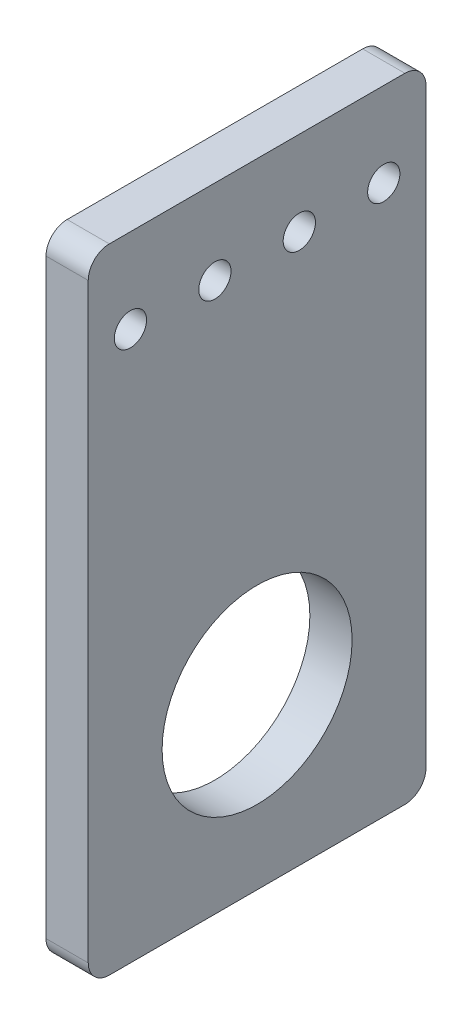
ISO-10303-21;
HEADER;
FILE_DESCRIPTION(('STEP AP214'),'2;1');
FILE_NAME('part.step','',(''),(''),'','','');
FILE_SCHEMA(('AUTOMOTIVE_DESIGN { 1 0 10303 214 1 1 1 1 }'));
ENDSEC;
DATA;
#1=APPLICATION_CONTEXT('core data for automotive mechanical design processes');
#2=APPLICATION_PROTOCOL_DEFINITION('international standard','automotive_design',2000,#1);
#3=PRODUCT_CONTEXT('',#1,'mechanical');
#4=PRODUCT('Part','Part','',(#3));
#5=PRODUCT_RELATED_PRODUCT_CATEGORY('part','',(#4));
#6=PRODUCT_DEFINITION_FORMATION('','',#4);
#7=PRODUCT_DEFINITION_CONTEXT('part definition',#1,'design');
#8=PRODUCT_DEFINITION('design','',#6,#7);
#9=PRODUCT_DEFINITION_SHAPE('','',#8);
#10=(LENGTH_UNIT() NAMED_UNIT(*) SI_UNIT(.MILLI.,.METRE.));
#11=(NAMED_UNIT(*) PLANE_ANGLE_UNIT() SI_UNIT($,.RADIAN.));
#12=(NAMED_UNIT(*) SI_UNIT($,.STERADIAN.) SOLID_ANGLE_UNIT());
#13=UNCERTAINTY_MEASURE_WITH_UNIT(LENGTH_MEASURE(1.E-05),#10,'distance_accuracy_value','');
#14=(GEOMETRIC_REPRESENTATION_CONTEXT(3) GLOBAL_UNCERTAINTY_ASSIGNED_CONTEXT((#13)) GLOBAL_UNIT_ASSIGNED_CONTEXT((#10,
#11,#12)) REPRESENTATION_CONTEXT('',''));
#15=CARTESIAN_POINT('',(0.,0.,0.));
#16=DIRECTION('',(0.,0.,1.));
#17=DIRECTION('',(1.,0.,0.));
#18=AXIS2_PLACEMENT_3D('',#15,#16,#17);
#19=CARTESIAN_POINT('',(285.75,-47.625,31.75));
#20=DIRECTION('',(0.,0.,-1.));
#21=DIRECTION('',(0.,1.,0.));
#22=AXIS2_PLACEMENT_3D('',#19,#20,#21);
#23=PLANE('',#22);
#24=DIRECTION('',(0.,-1.,0.));
#25=VECTOR('',#24,1.);
#26=CARTESIAN_POINT('',(285.75,-47.625,31.75));
#27=LINE('',#26,#25);
#28=CARTESIAN_POINT('',(285.75,-3.175,31.75));
#29=VERTEX_POINT('',#28);
#30=CARTESIAN_POINT('',(285.75,-92.075,31.75));
#31=VERTEX_POINT('',#30);
#32=EDGE_CURVE('E168',#29,#31,#27,.T.);
#33=ORIENTED_EDGE('',*,*,#32,.T.);
#34=DIRECTION('',(-1.,0.,0.));
#35=VECTOR('',#34,1.);
#36=CARTESIAN_POINT('',(279.4,-92.075,31.75));
#37=LINE('',#36,#35);
#38=CARTESIAN_POINT('',(279.4,-92.075,31.75));
#39=VERTEX_POINT('',#38);
#40=EDGE_CURVE('E150',#31,#39,#37,.T.);
#41=ORIENTED_EDGE('',*,*,#40,.T.);
#42=DIRECTION('',(0.,-1.,0.));
#43=VECTOR('',#42,1.);
#44=CARTESIAN_POINT('',(279.4,-47.625,31.75));
#45=LINE('',#44,#43);
#46=CARTESIAN_POINT('',(279.4,-3.175,31.75));
#47=VERTEX_POINT('',#46);
#48=EDGE_CURVE('E109',#47,#39,#45,.T.);
#49=ORIENTED_EDGE('',*,*,#48,.F.);
#50=DIRECTION('',(-1.,0.,0.));
#51=VECTOR('',#50,1.);
#52=CARTESIAN_POINT('',(285.75,-3.175,31.75));
#53=LINE('',#52,#51);
#54=EDGE_CURVE('E148',#47,#29,#53,.F.);
#55=ORIENTED_EDGE('',*,*,#54,.T.);
#56=EDGE_LOOP('',(#33,#41,#49,#55));
#57=FACE_BOUND('',#56,.T.);
#58=ADVANCED_FACE('F17',(#57),#23,.T.);
#59=CARTESIAN_POINT('',(285.75,0.,622.3));
#60=DIRECTION('',(0.,-1.,0.));
#61=DIRECTION('',(0.,0.,-1.));
#62=AXIS2_PLACEMENT_3D('',#59,#60,#61);
#63=PLANE('',#62);
#64=DIRECTION('',(0.,0.,1.));
#65=VECTOR('',#64,1.);
#66=CARTESIAN_POINT('',(279.4,0.,622.3));
#67=LINE('',#66,#65);
#68=CARTESIAN_POINT('',(279.4,0.,34.925));
#69=VERTEX_POINT('',#68);
#70=CARTESIAN_POINT('',(279.4,0.,79.375));
#71=VERTEX_POINT('',#70);
#72=EDGE_CURVE('E129',#69,#71,#67,.T.);
#73=ORIENTED_EDGE('',*,*,#72,.T.);
#74=DIRECTION('',(-1.,0.,0.));
#75=VECTOR('',#74,1.);
#76=CARTESIAN_POINT('',(285.75,0.,79.375));
#77=LINE('',#76,#75);
#78=CARTESIAN_POINT('',(285.75,0.,79.375));
#79=VERTEX_POINT('',#78);
#80=EDGE_CURVE('E11',#71,#79,#77,.F.);
#81=ORIENTED_EDGE('',*,*,#80,.T.);
#82=DIRECTION('',(0.,0.,1.));
#83=VECTOR('',#82,1.);
#84=CARTESIAN_POINT('',(285.75,0.,622.3));
#85=LINE('',#84,#83);
#86=CARTESIAN_POINT('',(285.75,0.,34.925));
#87=VERTEX_POINT('',#86);
#88=EDGE_CURVE('E132',#87,#79,#85,.T.);
#89=ORIENTED_EDGE('',*,*,#88,.F.);
#90=DIRECTION('',(-1.,0.,0.));
#91=VECTOR('',#90,1.);
#92=CARTESIAN_POINT('',(279.4,0.,34.925));
#93=LINE('',#92,#91);
#94=EDGE_CURVE('E25',#87,#69,#93,.T.);
#95=ORIENTED_EDGE('',*,*,#94,.T.);
#96=EDGE_LOOP('',(#73,#81,#89,#95));
#97=FACE_BOUND('',#96,.T.);
#98=ADVANCED_FACE('F155',(#97),#63,.F.);
#99=CARTESIAN_POINT('',(285.75,-47.625,82.55));
#100=DIRECTION('',(0.,0.,-1.));
#101=DIRECTION('',(-1.,0.,0.));
#102=AXIS2_PLACEMENT_3D('',#99,#100,#101);
#103=PLANE('',#102);
#104=DIRECTION('',(0.,-1.,0.));
#105=VECTOR('',#104,1.);
#106=CARTESIAN_POINT('',(279.4,-47.625,82.55));
#107=LINE('',#106,#105);
#108=CARTESIAN_POINT('',(279.4,-3.175,82.55));
#109=VERTEX_POINT('',#108);
#110=CARTESIAN_POINT('',(279.4,-92.075,82.55));
#111=VERTEX_POINT('',#110);
#112=EDGE_CURVE('E110',#109,#111,#107,.T.);
#113=ORIENTED_EDGE('',*,*,#112,.T.);
#114=DIRECTION('',(-1.,0.,0.));
#115=VECTOR('',#114,1.);
#116=CARTESIAN_POINT('',(285.75,-92.075,82.55));
#117=LINE('',#116,#115);
#118=CARTESIAN_POINT('',(285.75,-92.075,82.55));
#119=VERTEX_POINT('',#118);
#120=EDGE_CURVE('E87',#111,#119,#117,.F.);
#121=ORIENTED_EDGE('',*,*,#120,.T.);
#122=DIRECTION('',(0.,-1.,0.));
#123=VECTOR('',#122,1.);
#124=CARTESIAN_POINT('',(285.75,-47.625,82.55));
#125=LINE('',#124,#123);
#126=CARTESIAN_POINT('',(285.75,-3.175,82.55));
#127=VERTEX_POINT('',#126);
#128=EDGE_CURVE('E166',#127,#119,#125,.T.);
#129=ORIENTED_EDGE('',*,*,#128,.F.);
#130=DIRECTION('',(-1.,0.,0.));
#131=VECTOR('',#130,1.);
#132=CARTESIAN_POINT('',(285.75,-3.175,82.55));
#133=LINE('',#132,#131);
#134=EDGE_CURVE('E92',#127,#109,#133,.T.);
#135=ORIENTED_EDGE('',*,*,#134,.T.);
#136=EDGE_LOOP('',(#113,#121,#129,#135));
#137=FACE_BOUND('',#136,.T.);
#138=ADVANCED_FACE('F164',(#137),#103,.F.);
#139=CARTESIAN_POINT('',(285.75,-12.7,76.2));
#140=DIRECTION('',(-1.,0.,0.));
#141=DIRECTION('',(0.,0.,1.));
#142=AXIS2_PLACEMENT_3D('',#139,#140,#141);
#143=CYLINDRICAL_SURFACE('',#142,2.4257);
#144=CARTESIAN_POINT('',(285.75,-12.7,76.2));
#145=DIRECTION('',(1.,0.,0.));
#146=DIRECTION('',(0.,0.,-1.));
#147=AXIS2_PLACEMENT_3D('',#144,#145,#146);
#148=CIRCLE('',#147,2.4257);
#149=CARTESIAN_POINT('',(285.75,-12.7,73.7743));
#150=VERTEX_POINT('',#149);
#151=EDGE_CURVE('E181',#150,#150,#148,.T.);
#152=ORIENTED_EDGE('',*,*,#151,.T.);
#153=EDGE_LOOP('',(#152));
#154=FACE_BOUND('',#153,.T.);
#155=CARTESIAN_POINT('',(279.4,-12.7,76.2));
#156=DIRECTION('',(1.,0.,0.));
#157=DIRECTION('',(0.,0.,-1.));
#158=AXIS2_PLACEMENT_3D('',#155,#156,#157);
#159=CIRCLE('',#158,2.4257);
#160=CARTESIAN_POINT('',(279.4,-12.7,73.7743));
#161=VERTEX_POINT('',#160);
#162=EDGE_CURVE('E123',#161,#161,#159,.T.);
#163=ORIENTED_EDGE('',*,*,#162,.F.);
#164=EDGE_LOOP('',(#163));
#165=FACE_BOUND('',#164,.T.);
#166=ADVANCED_FACE('F218',(#154,#165),#143,.F.);
#167=CARTESIAN_POINT('',(285.75,-12.7,63.5));
#168=DIRECTION('',(-1.,0.,0.));
#169=DIRECTION('',(0.,0.,1.));
#170=AXIS2_PLACEMENT_3D('',#167,#168,#169);
#171=CYLINDRICAL_SURFACE('',#170,2.4257);
#172=CARTESIAN_POINT('',(285.75,-12.7,63.5));
#173=DIRECTION('',(1.,0.,0.));
#174=DIRECTION('',(0.,0.,-1.));
#175=AXIS2_PLACEMENT_3D('',#172,#173,#174);
#176=CIRCLE('',#175,2.4257);
#177=CARTESIAN_POINT('',(285.75,-12.7,61.0743));
#178=VERTEX_POINT('',#177);
#179=EDGE_CURVE('E178',#178,#178,#176,.T.);
#180=ORIENTED_EDGE('',*,*,#179,.T.);
#181=EDGE_LOOP('',(#180));
#182=FACE_BOUND('',#181,.T.);
#183=CARTESIAN_POINT('',(279.4,-12.7,63.5));
#184=DIRECTION('',(1.,0.,0.));
#185=DIRECTION('',(0.,0.,-1.));
#186=AXIS2_PLACEMENT_3D('',#183,#184,#185);
#187=CIRCLE('',#186,2.4257);
#188=CARTESIAN_POINT('',(279.4,-12.7,61.0743));
#189=VERTEX_POINT('',#188);
#190=EDGE_CURVE('E120',#189,#189,#187,.T.);
#191=ORIENTED_EDGE('',*,*,#190,.F.);
#192=EDGE_LOOP('',(#191));
#193=FACE_BOUND('',#192,.T.);
#194=ADVANCED_FACE('F222',(#182,#193),#171,.F.);
#195=CARTESIAN_POINT('',(285.75,-12.7,50.8));
#196=DIRECTION('',(-1.,0.,0.));
#197=DIRECTION('',(0.,0.,1.));
#198=AXIS2_PLACEMENT_3D('',#195,#196,#197);
#199=CYLINDRICAL_SURFACE('',#198,2.4257);
#200=CARTESIAN_POINT('',(285.75,-12.7,50.8));
#201=DIRECTION('',(1.,0.,0.));
#202=DIRECTION('',(0.,0.,-1.));
#203=AXIS2_PLACEMENT_3D('',#200,#201,#202);
#204=CIRCLE('',#203,2.4257);
#205=CARTESIAN_POINT('',(285.75,-12.7,48.3743));
#206=VERTEX_POINT('',#205);
#207=EDGE_CURVE('E175',#206,#206,#204,.T.);
#208=ORIENTED_EDGE('',*,*,#207,.T.);
#209=EDGE_LOOP('',(#208));
#210=FACE_BOUND('',#209,.T.);
#211=CARTESIAN_POINT('',(279.4,-12.7,50.8));
#212=DIRECTION('',(1.,0.,0.));
#213=DIRECTION('',(0.,0.,-1.));
#214=AXIS2_PLACEMENT_3D('',#211,#212,#213);
#215=CIRCLE('',#214,2.4257);
#216=CARTESIAN_POINT('',(279.4,-12.7,48.3743));
#217=VERTEX_POINT('',#216);
#218=EDGE_CURVE('E112',#217,#217,#215,.T.);
#219=ORIENTED_EDGE('',*,*,#218,.F.);
#220=EDGE_LOOP('',(#219));
#221=FACE_BOUND('',#220,.T.);
#222=ADVANCED_FACE('F204',(#210,#221),#199,.F.);
#223=CARTESIAN_POINT('',(285.75,-95.25,57.15));
#224=DIRECTION('',(0.,1.,0.));
#225=DIRECTION('',(0.,0.,1.));
#226=AXIS2_PLACEMENT_3D('',#223,#224,#225);
#227=PLANE('',#226);
#228=DIRECTION('',(0.,0.,-1.));
#229=VECTOR('',#228,1.);
#230=CARTESIAN_POINT('',(285.75,-95.25,57.15));
#231=LINE('',#230,#229);
#232=CARTESIAN_POINT('',(285.75,-95.25,79.375));
#233=VERTEX_POINT('',#232);
#234=CARTESIAN_POINT('',(285.75,-95.25,34.925));
#235=VERTEX_POINT('',#234);
#236=EDGE_CURVE('E102',#233,#235,#231,.T.);
#237=ORIENTED_EDGE('',*,*,#236,.F.);
#238=DIRECTION('',(-1.,0.,0.));
#239=VECTOR('',#238,1.);
#240=CARTESIAN_POINT('',(285.75,-95.25,79.375));
#241=LINE('',#240,#239);
#242=CARTESIAN_POINT('',(279.4,-95.25,79.375));
#243=VERTEX_POINT('',#242);
#244=EDGE_CURVE('E86',#233,#243,#241,.T.);
#245=ORIENTED_EDGE('',*,*,#244,.T.);
#246=DIRECTION('',(0.,0.,-1.));
#247=VECTOR('',#246,1.);
#248=CARTESIAN_POINT('',(279.4,-95.25,57.15));
#249=LINE('',#248,#247);
#250=CARTESIAN_POINT('',(279.4,-95.25,34.925));
#251=VERTEX_POINT('',#250);
#252=EDGE_CURVE('E99',#243,#251,#249,.T.);
#253=ORIENTED_EDGE('',*,*,#252,.T.);
#254=DIRECTION('',(-1.,0.,0.));
#255=VECTOR('',#254,1.);
#256=CARTESIAN_POINT('',(285.75,-95.25,34.925));
#257=LINE('',#256,#255);
#258=EDGE_CURVE('E104',#251,#235,#257,.F.);
#259=ORIENTED_EDGE('',*,*,#258,.T.);
#260=EDGE_LOOP('',(#237,#245,#253,#259));
#261=FACE_BOUND('',#260,.T.);
#262=ADVANCED_FACE('F98',(#261),#227,.F.);
#263=CARTESIAN_POINT('',(285.75,-69.85,57.15));
#264=DIRECTION('',(-1.,0.,0.));
#265=DIRECTION('',(0.,0.,1.));
#266=AXIS2_PLACEMENT_3D('',#263,#264,#265);
#267=CYLINDRICAL_SURFACE('',#266,14.2875);
#268=CARTESIAN_POINT('',(285.75,-69.85,57.15));
#269=DIRECTION('',(1.,0.,0.));
#270=DIRECTION('',(0.,0.,-1.));
#271=AXIS2_PLACEMENT_3D('',#268,#269,#270);
#272=CIRCLE('',#271,14.2875);
#273=CARTESIAN_POINT('',(285.75,-69.85,42.8625));
#274=VERTEX_POINT('',#273);
#275=EDGE_CURVE('E131',#274,#274,#272,.T.);
#276=ORIENTED_EDGE('',*,*,#275,.T.);
#277=EDGE_LOOP('',(#276));
#278=FACE_BOUND('',#277,.T.);
#279=CARTESIAN_POINT('',(279.4,-69.85,57.15));
#280=DIRECTION('',(1.,0.,0.));
#281=DIRECTION('',(0.,0.,-1.));
#282=AXIS2_PLACEMENT_3D('',#279,#280,#281);
#283=CIRCLE('',#282,14.2875);
#284=CARTESIAN_POINT('',(279.4,-69.85,42.8625));
#285=VERTEX_POINT('',#284);
#286=EDGE_CURVE('E114',#285,#285,#283,.T.);
#287=ORIENTED_EDGE('',*,*,#286,.F.);
#288=EDGE_LOOP('',(#287));
#289=FACE_BOUND('',#288,.T.);
#290=ADVANCED_FACE('F191',(#278,#289),#267,.F.);
#291=CARTESIAN_POINT('',(285.75,-12.7,38.1));
#292=DIRECTION('',(-1.,0.,0.));
#293=DIRECTION('',(0.,0.,1.));
#294=AXIS2_PLACEMENT_3D('',#291,#292,#293);
#295=CYLINDRICAL_SURFACE('',#294,2.4257);
#296=CARTESIAN_POINT('',(285.75,-12.7,38.1));
#297=DIRECTION('',(1.,0.,0.));
#298=DIRECTION('',(0.,0.,-1.));
#299=AXIS2_PLACEMENT_3D('',#296,#297,#298);
#300=CIRCLE('',#299,2.4257);
#301=CARTESIAN_POINT('',(285.75,-12.7,35.6743));
#302=VERTEX_POINT('',#301);
#303=EDGE_CURVE('E184',#302,#302,#300,.T.);
#304=ORIENTED_EDGE('',*,*,#303,.T.);
#305=EDGE_LOOP('',(#304));
#306=FACE_BOUND('',#305,.T.);
#307=CARTESIAN_POINT('',(279.4,-12.7,38.1));
#308=DIRECTION('',(1.,0.,0.));
#309=DIRECTION('',(0.,0.,-1.));
#310=AXIS2_PLACEMENT_3D('',#307,#308,#309);
#311=CIRCLE('',#310,2.4257);
#312=CARTESIAN_POINT('',(279.4,-12.7,35.6743));
#313=VERTEX_POINT('',#312);
#314=EDGE_CURVE('E126',#313,#313,#311,.T.);
#315=ORIENTED_EDGE('',*,*,#314,.F.);
#316=EDGE_LOOP('',(#315));
#317=FACE_BOUND('',#316,.T.);
#318=ADVANCED_FACE('F193',(#306,#317),#295,.F.);
#319=CARTESIAN_POINT('',(285.75,-47.625,622.3));
#320=DIRECTION('',(1.,0.,0.));
#321=DIRECTION('',(0.,1.,0.));
#322=AXIS2_PLACEMENT_3D('',#319,#320,#321);
#323=PLANE('',#322);
#324=ORIENTED_EDGE('',*,*,#275,.F.);
#325=EDGE_LOOP('',(#324));
#326=FACE_BOUND('',#325,.T.);
#327=ORIENTED_EDGE('',*,*,#128,.T.);
#328=CARTESIAN_POINT('',(285.75,-92.075,79.375));
#329=DIRECTION('',(1.,0.,0.));
#330=DIRECTION('',(0.,0.,-1.));
#331=AXIS2_PLACEMENT_3D('',#328,#329,#330);
#332=CIRCLE('',#331,3.175);
#333=EDGE_CURVE('E146',#119,#233,#332,.T.);
#334=ORIENTED_EDGE('',*,*,#333,.T.);
#335=ORIENTED_EDGE('',*,*,#236,.T.);
#336=CARTESIAN_POINT('',(285.75,-92.075,34.925));
#337=DIRECTION('',(1.,0.,0.));
#338=DIRECTION('',(0.,0.,-1.));
#339=AXIS2_PLACEMENT_3D('',#336,#337,#338);
#340=CIRCLE('',#339,3.175);
#341=EDGE_CURVE('E144',#235,#31,#340,.T.);
#342=ORIENTED_EDGE('',*,*,#341,.T.);
#343=ORIENTED_EDGE('',*,*,#32,.F.);
#344=CARTESIAN_POINT('',(285.75,-3.175,34.925));
#345=DIRECTION('',(1.,0.,0.));
#346=DIRECTION('',(0.,0.,-1.));
#347=AXIS2_PLACEMENT_3D('',#344,#345,#346);
#348=CIRCLE('',#347,3.175);
#349=EDGE_CURVE('E37',#29,#87,#348,.T.);
#350=ORIENTED_EDGE('',*,*,#349,.T.);
#351=ORIENTED_EDGE('',*,*,#88,.T.);
#352=CARTESIAN_POINT('',(285.75,-3.175,79.375));
#353=DIRECTION('',(1.,0.,0.));
#354=DIRECTION('',(0.,0.,-1.));
#355=AXIS2_PLACEMENT_3D('',#352,#353,#354);
#356=CIRCLE('',#355,3.175);
#357=EDGE_CURVE('E142',#79,#127,#356,.T.);
#358=ORIENTED_EDGE('',*,*,#357,.T.);
#359=EDGE_LOOP('',(#327,#334,#335,#342,#343,#350,#351,#358));
#360=FACE_BOUND('',#359,.T.);
#361=ORIENTED_EDGE('',*,*,#207,.F.);
#362=EDGE_LOOP('',(#361));
#363=FACE_BOUND('',#362,.T.);
#364=ORIENTED_EDGE('',*,*,#179,.F.);
#365=EDGE_LOOP('',(#364));
#366=FACE_BOUND('',#365,.T.);
#367=ORIENTED_EDGE('',*,*,#151,.F.);
#368=EDGE_LOOP('',(#367));
#369=FACE_BOUND('',#368,.T.);
#370=ORIENTED_EDGE('',*,*,#303,.F.);
#371=EDGE_LOOP('',(#370));
#372=FACE_BOUND('',#371,.T.);
#373=ADVANCED_FACE('F201',(#326,#360,#363,#366,#369,#372),#323,.T.);
#374=CARTESIAN_POINT('',(279.4,-47.625,622.3));
#375=DIRECTION('',(1.,0.,0.));
#376=DIRECTION('',(0.,1.,0.));
#377=AXIS2_PLACEMENT_3D('',#374,#375,#376);
#378=PLANE('',#377);
#379=ORIENTED_EDGE('',*,*,#286,.T.);
#380=EDGE_LOOP('',(#379));
#381=FACE_BOUND('',#380,.T.);
#382=ORIENTED_EDGE('',*,*,#252,.F.);
#383=CARTESIAN_POINT('',(279.4,-92.075,79.375));
#384=DIRECTION('',(1.,0.,0.));
#385=DIRECTION('',(0.,0.,-1.));
#386=AXIS2_PLACEMENT_3D('',#383,#384,#385);
#387=CIRCLE('',#386,3.175);
#388=EDGE_CURVE('E82',#243,#111,#387,.F.);
#389=ORIENTED_EDGE('',*,*,#388,.T.);
#390=ORIENTED_EDGE('',*,*,#112,.F.);
#391=CARTESIAN_POINT('',(279.4,-3.175,79.375));
#392=DIRECTION('',(1.,0.,0.));
#393=DIRECTION('',(0.,0.,-1.));
#394=AXIS2_PLACEMENT_3D('',#391,#392,#393);
#395=CIRCLE('',#394,3.175);
#396=EDGE_CURVE('E135',#109,#71,#395,.F.);
#397=ORIENTED_EDGE('',*,*,#396,.T.);
#398=ORIENTED_EDGE('',*,*,#72,.F.);
#399=CARTESIAN_POINT('',(279.4,-3.175,34.925));
#400=DIRECTION('',(1.,0.,0.));
#401=DIRECTION('',(0.,0.,-1.));
#402=AXIS2_PLACEMENT_3D('',#399,#400,#401);
#403=CIRCLE('',#402,3.175);
#404=EDGE_CURVE('E103',#69,#47,#403,.F.);
#405=ORIENTED_EDGE('',*,*,#404,.T.);
#406=ORIENTED_EDGE('',*,*,#48,.T.);
#407=CARTESIAN_POINT('',(279.4,-92.075,34.925));
#408=DIRECTION('',(1.,0.,0.));
#409=DIRECTION('',(0.,0.,-1.));
#410=AXIS2_PLACEMENT_3D('',#407,#408,#409);
#411=CIRCLE('',#410,3.175);
#412=EDGE_CURVE('E93',#39,#251,#411,.F.);
#413=ORIENTED_EDGE('',*,*,#412,.T.);
#414=EDGE_LOOP('',(#382,#389,#390,#397,#398,#405,#406,#413));
#415=FACE_BOUND('',#414,.T.);
#416=ORIENTED_EDGE('',*,*,#218,.T.);
#417=EDGE_LOOP('',(#416));
#418=FACE_BOUND('',#417,.T.);
#419=ORIENTED_EDGE('',*,*,#190,.T.);
#420=EDGE_LOOP('',(#419));
#421=FACE_BOUND('',#420,.T.);
#422=ORIENTED_EDGE('',*,*,#162,.T.);
#423=EDGE_LOOP('',(#422));
#424=FACE_BOUND('',#423,.T.);
#425=ORIENTED_EDGE('',*,*,#314,.T.);
#426=EDGE_LOOP('',(#425));
#427=FACE_BOUND('',#426,.T.);
#428=ADVANCED_FACE('F106',(#381,#415,#418,#421,#424,#427),#378,.F.);
#429=CARTESIAN_POINT('',(285.75,-92.075,79.375));
#430=DIRECTION('',(-1.,0.,0.));
#431=DIRECTION('',(0.,0.,1.));
#432=AXIS2_PLACEMENT_3D('',#429,#430,#431);
#433=CYLINDRICAL_SURFACE('',#432,3.175);
#434=ORIENTED_EDGE('',*,*,#333,.F.);
#435=ORIENTED_EDGE('',*,*,#120,.F.);
#436=ORIENTED_EDGE('',*,*,#388,.F.);
#437=ORIENTED_EDGE('',*,*,#244,.F.);
#438=EDGE_LOOP('',(#434,#435,#436,#437));
#439=FACE_BOUND('',#438,.T.);
#440=ADVANCED_FACE('F85',(#439),#433,.T.);
#441=CARTESIAN_POINT('',(285.75,-92.075,34.925));
#442=DIRECTION('',(1.,0.,0.));
#443=DIRECTION('',(0.,0.,-1.));
#444=AXIS2_PLACEMENT_3D('',#441,#442,#443);
#445=CYLINDRICAL_SURFACE('',#444,3.175);
#446=ORIENTED_EDGE('',*,*,#341,.F.);
#447=ORIENTED_EDGE('',*,*,#258,.F.);
#448=ORIENTED_EDGE('',*,*,#412,.F.);
#449=ORIENTED_EDGE('',*,*,#40,.F.);
#450=EDGE_LOOP('',(#446,#447,#448,#449));
#451=FACE_BOUND('',#450,.T.);
#452=ADVANCED_FACE('F290',(#451),#445,.T.);
#453=CARTESIAN_POINT('',(285.75,-3.175,79.375));
#454=DIRECTION('',(-1.,0.,0.));
#455=DIRECTION('',(0.,0.,1.));
#456=AXIS2_PLACEMENT_3D('',#453,#454,#455);
#457=CYLINDRICAL_SURFACE('',#456,3.175);
#458=ORIENTED_EDGE('',*,*,#357,.F.);
#459=ORIENTED_EDGE('',*,*,#80,.F.);
#460=ORIENTED_EDGE('',*,*,#396,.F.);
#461=ORIENTED_EDGE('',*,*,#134,.F.);
#462=EDGE_LOOP('',(#458,#459,#460,#461));
#463=FACE_BOUND('',#462,.T.);
#464=ADVANCED_FACE('F161',(#463),#457,.T.);
#465=CARTESIAN_POINT('',(285.75,-3.175,34.925));
#466=DIRECTION('',(1.,0.,0.));
#467=DIRECTION('',(0.,0.,-1.));
#468=AXIS2_PLACEMENT_3D('',#465,#466,#467);
#469=CYLINDRICAL_SURFACE('',#468,3.175);
#470=ORIENTED_EDGE('',*,*,#349,.F.);
#471=ORIENTED_EDGE('',*,*,#54,.F.);
#472=ORIENTED_EDGE('',*,*,#404,.F.);
#473=ORIENTED_EDGE('',*,*,#94,.F.);
#474=EDGE_LOOP('',(#470,#471,#472,#473));
#475=FACE_BOUND('',#474,.T.);
#476=ADVANCED_FACE('F19',(#475),#469,.T.);
#477=CLOSED_SHELL('',(#58,#98,#138,#166,#194,#222,#262,#290,#318,#373,#428,#440,#452,#464,#476));
#478=MANIFOLD_SOLID_BREP('B1',#477);
#479=ADVANCED_BREP_SHAPE_REPRESENTATION('',(#18,#478),#14);
#480=SHAPE_DEFINITION_REPRESENTATION(#9,#479);
ENDSEC;
END-ISO-10303-21;
